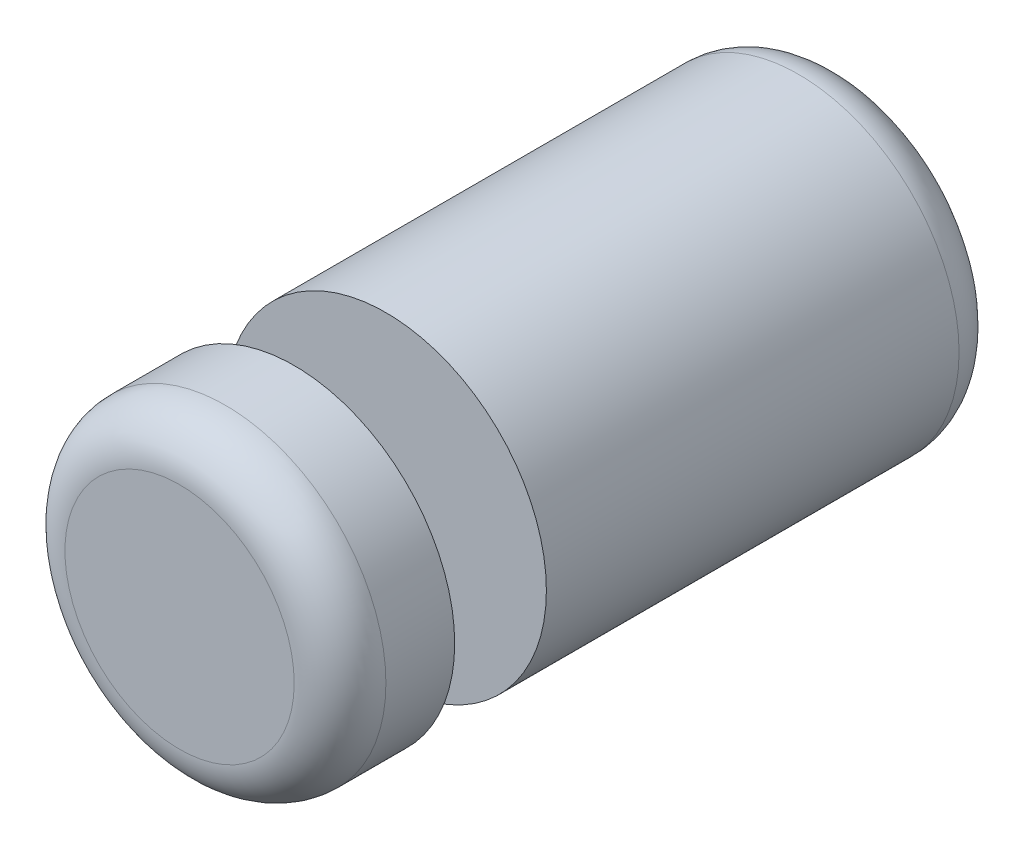
ISO-10303-21;
HEADER;
FILE_DESCRIPTION(('STEP AP214'),'2;1');
FILE_NAME('part.step','',(''),(''),'','','');
FILE_SCHEMA(('AUTOMOTIVE_DESIGN { 1 0 10303 214 1 1 1 1 }'));
ENDSEC;
DATA;
#1=APPLICATION_CONTEXT('core data for automotive mechanical design processes');
#2=APPLICATION_PROTOCOL_DEFINITION('international standard','automotive_design',2000,#1);
#3=PRODUCT_CONTEXT('',#1,'mechanical');
#4=PRODUCT('Part','Part','',(#3));
#5=PRODUCT_RELATED_PRODUCT_CATEGORY('part','',(#4));
#6=PRODUCT_DEFINITION_FORMATION('','',#4);
#7=PRODUCT_DEFINITION_CONTEXT('part definition',#1,'design');
#8=PRODUCT_DEFINITION('design','',#6,#7);
#9=PRODUCT_DEFINITION_SHAPE('','',#8);
#10=(LENGTH_UNIT() NAMED_UNIT(*) SI_UNIT(.MILLI.,.METRE.));
#11=(NAMED_UNIT(*) PLANE_ANGLE_UNIT() SI_UNIT($,.RADIAN.));
#12=(NAMED_UNIT(*) SI_UNIT($,.STERADIAN.) SOLID_ANGLE_UNIT());
#13=UNCERTAINTY_MEASURE_WITH_UNIT(LENGTH_MEASURE(1.E-05),#10,'distance_accuracy_value','');
#14=(GEOMETRIC_REPRESENTATION_CONTEXT(3) GLOBAL_UNCERTAINTY_ASSIGNED_CONTEXT((#13)) GLOBAL_UNIT_ASSIGNED_CONTEXT((#10,
#11,#12)) REPRESENTATION_CONTEXT('',''));
#15=CARTESIAN_POINT('',(0.,0.,0.));
#16=DIRECTION('',(0.,0.,1.));
#17=DIRECTION('',(1.,0.,0.));
#18=AXIS2_PLACEMENT_3D('',#15,#16,#17);
#19=CARTESIAN_POINT('',(0.,0.,2.9));
#20=DIRECTION('',(0.,0.,1.));
#21=DIRECTION('',(1.,0.,0.));
#22=AXIS2_PLACEMENT_3D('',#19,#20,#21);
#23=PLANE('',#22);
#24=CARTESIAN_POINT('',(0.,0.,2.9));
#25=DIRECTION('',(0.,0.,-1.));
#26=DIRECTION('',(-1.,0.,0.));
#27=AXIS2_PLACEMENT_3D('',#24,#25,#26);
#28=CIRCLE('',#27,0.5);
#29=CARTESIAN_POINT('',(0.5,0.,2.9));
#30=VERTEX_POINT('',#29);
#31=EDGE_CURVE('P0_E20',#30,#30,#28,.T.);
#32=ORIENTED_EDGE('',*,*,#31,.F.);
#33=EDGE_LOOP('',(#32));
#34=FACE_BOUND('',#33,.T.);
#35=ADVANCED_FACE('P0_F17',(#34),#23,.T.);
#36=CARTESIAN_POINT('',(0.,0.,0.));
#37=DIRECTION('',(0.,0.,1.));
#38=DIRECTION('',(-1.,0.,0.));
#39=AXIS2_PLACEMENT_3D('',#36,#37,#38);
#40=CYLINDRICAL_SURFACE('',#39,0.7);
#41=CARTESIAN_POINT('',(0.,0.,2.399985133632));
#42=DIRECTION('',(0.,0.,1.));
#43=DIRECTION('',(-1.,0.,0.));
#44=AXIS2_PLACEMENT_3D('',#41,#42,#43);
#45=CIRCLE('',#44,0.7);
#46=CARTESIAN_POINT('',(0.7,0.,2.399985133632));
#47=VERTEX_POINT('',#46);
#48=EDGE_CURVE('P0_E50',#47,#47,#45,.T.);
#49=ORIENTED_EDGE('',*,*,#48,.T.);
#50=CARTESIAN_POINT('',(0.7,0.,2.399985133632));
#51=CARTESIAN_POINT('',(0.7,0.,2.7));
#52=(BOUNDED_CURVE() B_SPLINE_CURVE(1,(#50,#51),.UNSPECIFIED.,.F.,
.F.) B_SPLINE_CURVE_WITH_KNOTS((2,2),(2.399985133632,2.7),
.UNSPECIFIED.) CURVE() GEOMETRIC_REPRESENTATION_ITEM() RATIONAL_B_SPLINE_CURVE((1.,1.)) REPRESENTATION_ITEM(''));
#53=CARTESIAN_POINT('',(0.7,0.,2.7));
#54=VERTEX_POINT('',#53);
#55=EDGE_CURVE('P0_E11',#47,#54,#52,.T.);
#56=ORIENTED_EDGE('',*,*,#55,.T.);
#57=CARTESIAN_POINT('',(0.,0.,2.7));
#58=DIRECTION('',(0.,0.,1.));
#59=DIRECTION('',(-1.,0.,0.));
#60=AXIS2_PLACEMENT_3D('',#57,#58,#59);
#61=CIRCLE('',#60,0.7);
#62=EDGE_CURVE('P0_E52',#54,#54,#61,.T.);
#63=ORIENTED_EDGE('',*,*,#62,.F.);
#64=ORIENTED_EDGE('',*,*,#55,.F.);
#65=EDGE_LOOP('',(#49,#56,#63,#64));
#66=FACE_BOUND('',#65,.T.);
#67=ADVANCED_FACE('P0_F48',(#66),#40,.T.);
#68=CARTESIAN_POINT('',(0.,0.,2.7));
#69=DIRECTION('',(0.,0.,1.));
#70=DIRECTION('',(1.,0.,0.));
#71=AXIS2_PLACEMENT_3D('',#68,#69,#70);
#72=TOROIDAL_SURFACE('',#71,0.5,0.2);
#73=ORIENTED_EDGE('',*,*,#62,.T.);
#74=CARTESIAN_POINT('',(0.7,0.,2.7));
#75=CARTESIAN_POINT('',(0.7,0.,2.753467356631));
#76=CARTESIAN_POINT('',(0.682999129873001,0.,2.805541714516));
#77=CARTESIAN_POINT('',(0.650383902640001,0.,2.85038390264));
#78=CARTESIAN_POINT('',(0.605541714516,0.,2.882999129873));
#79=CARTESIAN_POINT('',(0.553467356631,0.,2.9));
#80=CARTESIAN_POINT('',(0.5,0.,2.9));
#81=(BOUNDED_CURVE() B_SPLINE_CURVE(6,(#74,#75,#76,#77,#78,#79,#80),.UNSPECIFIED.,.F.,
.F.) B_SPLINE_CURVE_WITH_KNOTS((7,7),(0.,1.570796326795),
.UNSPECIFIED.) CURVE() GEOMETRIC_REPRESENTATION_ITEM() RATIONAL_B_SPLINE_CURVE((1.031393471788,
1.010025407661,0.997924642725,0.993958444137,0.997924642725,1.010025407661,1.031393471788)) REPRESENTATION_ITEM(''));
#82=EDGE_CURVE('P0_E54',#54,#30,#81,.T.);
#83=ORIENTED_EDGE('',*,*,#82,.T.);
#84=ORIENTED_EDGE('',*,*,#31,.T.);
#85=ORIENTED_EDGE('',*,*,#82,.F.);
#86=EDGE_LOOP('',(#73,#83,#84,#85));
#87=FACE_BOUND('',#86,.T.);
#88=ADVANCED_FACE('P0_F82',(#87),#72,.T.);
#89=CARTESIAN_POINT('',(0.,0.701441490006,2.399985133632));
#90=DIRECTION('',(0.,0.,1.));
#91=DIRECTION('',(1.,0.,0.));
#92=AXIS2_PLACEMENT_3D('',#89,#90,#91);
#93=PLANE('',#92);
#94=ORIENTED_EDGE('',*,*,#48,.F.);
#95=EDGE_LOOP('',(#94));
#96=FACE_BOUND('',#95,.T.);
#97=ADVANCED_FACE('P0_F77',(#96),#93,.F.);
#98=CLOSED_SHELL('',(#35,#67,#88,#97));
#99=MANIFOLD_SOLID_BREP('P0_B1',#98);
#100=CARTESIAN_POINT('',(0.,-0.700974555471,2.000018357622));
#101=DIRECTION('',(0.,0.,-1.));
#102=DIRECTION('',(0.,-1.,0.));
#103=AXIS2_PLACEMENT_3D('',#100,#101,#102);
#104=PLANE('',#103);
#105=CARTESIAN_POINT('',(0.,0.,2.000018357622));
#106=DIRECTION('',(0.,0.,-1.));
#107=DIRECTION('',(-1.,0.,0.));
#108=AXIS2_PLACEMENT_3D('',#105,#106,#107);
#109=CIRCLE('',#108,0.7);
#110=CARTESIAN_POINT('',(0.7,0.,2.000018357622));
#111=VERTEX_POINT('',#110);
#112=EDGE_CURVE('P1_E11',#111,#111,#109,.T.);
#113=ORIENTED_EDGE('',*,*,#112,.F.);
#114=EDGE_LOOP('',(#113));
#115=FACE_BOUND('',#114,.T.);
#116=ADVANCED_FACE('P1_F17',(#115),#104,.F.);
#117=CARTESIAN_POINT('',(0.,0.,0.));
#118=DIRECTION('',(0.,0.,1.));
#119=DIRECTION('',(-1.,0.,0.));
#120=AXIS2_PLACEMENT_3D('',#117,#118,#119);
#121=CYLINDRICAL_SURFACE('',#120,0.7);
#122=CARTESIAN_POINT('',(0.,0.,0.2));
#123=DIRECTION('',(0.,0.,-1.));
#124=DIRECTION('',(-1.,0.,0.));
#125=AXIS2_PLACEMENT_3D('',#122,#123,#124);
#126=CIRCLE('',#125,0.7);
#127=CARTESIAN_POINT('',(0.7,0.,0.2));
#128=VERTEX_POINT('',#127);
#129=EDGE_CURVE('P1_E52',#128,#128,#126,.T.);
#130=ORIENTED_EDGE('',*,*,#129,.F.);
#131=CARTESIAN_POINT('',(0.7,0.,0.2));
#132=CARTESIAN_POINT('',(0.7,0.,2.000018357622));
#133=(BOUNDED_CURVE() B_SPLINE_CURVE(1,(#131,#132),.UNSPECIFIED.,.F.,
.F.) B_SPLINE_CURVE_WITH_KNOTS((2,2),(0.2,2.000018357622),
.UNSPECIFIED.) CURVE() GEOMETRIC_REPRESENTATION_ITEM() RATIONAL_B_SPLINE_CURVE((1.,1.)) REPRESENTATION_ITEM(''));
#134=EDGE_CURVE('P1_E25',#128,#111,#133,.T.);
#135=ORIENTED_EDGE('',*,*,#134,.T.);
#136=ORIENTED_EDGE('',*,*,#112,.T.);
#137=ORIENTED_EDGE('',*,*,#134,.F.);
#138=EDGE_LOOP('',(#130,#135,#136,#137));
#139=FACE_BOUND('',#138,.T.);
#140=ADVANCED_FACE('P1_F76',(#139),#121,.T.);
#141=CARTESIAN_POINT('',(0.,0.,0.2));
#142=DIRECTION('',(0.,0.,-1.));
#143=DIRECTION('',(-1.,0.,0.));
#144=AXIS2_PLACEMENT_3D('',#141,#142,#143);
#145=TOROIDAL_SURFACE('',#144,0.5,0.2);
#146=ORIENTED_EDGE('',*,*,#129,.T.);
#147=CARTESIAN_POINT('',(0.7,0.,0.2));
#148=CARTESIAN_POINT('',(0.7,0.,0.146532643369));
#149=CARTESIAN_POINT('',(0.682999129873001,0.,0.09445828548356));
#150=CARTESIAN_POINT('',(0.650383902640001,0.,0.04961609735954));
#151=CARTESIAN_POINT('',(0.605541714516,0.,0.01700087012674));
#152=CARTESIAN_POINT('',(0.553467356631,0.,0.));
#153=CARTESIAN_POINT('',(0.5,0.,0.));
#154=(BOUNDED_CURVE() B_SPLINE_CURVE(6,(#147,#148,#149,#150,#151,#152,#153),.UNSPECIFIED.,.F.,
.F.) B_SPLINE_CURVE_WITH_KNOTS((7,7),(0.,1.570796326795),
.UNSPECIFIED.) CURVE() GEOMETRIC_REPRESENTATION_ITEM() RATIONAL_B_SPLINE_CURVE((1.031393471788,
1.010025407661,0.997924642725,0.993958444137,0.997924642725,1.010025407661,1.031393471788)) REPRESENTATION_ITEM(''));
#155=CARTESIAN_POINT('',(0.5,0.,0.));
#156=VERTEX_POINT('',#155);
#157=EDGE_CURVE('P1_E48',#128,#156,#154,.T.);
#158=ORIENTED_EDGE('',*,*,#157,.T.);
#159=CARTESIAN_POINT('',(0.,0.,0.));
#160=DIRECTION('',(0.,0.,1.));
#161=DIRECTION('',(-1.,0.,0.));
#162=AXIS2_PLACEMENT_3D('',#159,#160,#161);
#163=CIRCLE('',#162,0.5);
#164=EDGE_CURVE('P1_E51',#156,#156,#163,.T.);
#165=ORIENTED_EDGE('',*,*,#164,.T.);
#166=ORIENTED_EDGE('',*,*,#157,.F.);
#167=EDGE_LOOP('',(#146,#158,#165,#166));
#168=FACE_BOUND('',#167,.T.);
#169=ADVANCED_FACE('P1_F49',(#168),#145,.T.);
#170=CARTESIAN_POINT('',(0.,0.,0.));
#171=DIRECTION('',(0.,0.,1.));
#172=DIRECTION('',(1.,0.,0.));
#173=AXIS2_PLACEMENT_3D('',#170,#171,#172);
#174=PLANE('',#173);
#175=ORIENTED_EDGE('',*,*,#164,.F.);
#176=EDGE_LOOP('',(#175));
#177=FACE_BOUND('',#176,.T.);
#178=ADVANCED_FACE('P1_F84',(#177),#174,.F.);
#179=CLOSED_SHELL('',(#116,#140,#169,#178));
#180=MANIFOLD_SOLID_BREP('P1_B1',#179);
#181=ADVANCED_BREP_SHAPE_REPRESENTATION('',(#18,#99,#180),#14);
#182=SHAPE_DEFINITION_REPRESENTATION(#9,#181);
ENDSEC;
END-ISO-10303-21;
